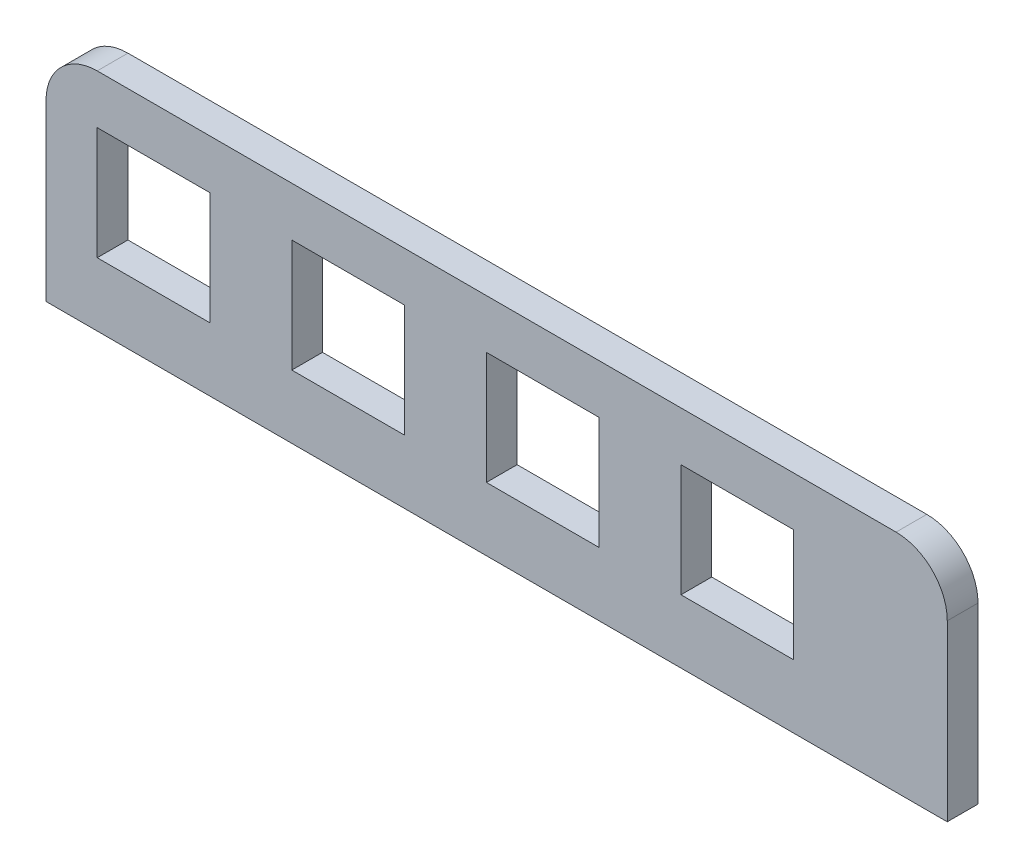
ISO-10303-21;
HEADER;
FILE_DESCRIPTION(('STEP AP214'),'2;1');
FILE_NAME('part.step','',(''),(''),'','','');
FILE_SCHEMA(('AUTOMOTIVE_DESIGN { 1 0 10303 214 1 1 1 1 }'));
ENDSEC;
DATA;
#1=APPLICATION_CONTEXT('core data for automotive mechanical design processes');
#2=APPLICATION_PROTOCOL_DEFINITION('international standard','automotive_design',2000,#1);
#3=PRODUCT_CONTEXT('',#1,'mechanical');
#4=PRODUCT('Part','Part','',(#3));
#5=PRODUCT_RELATED_PRODUCT_CATEGORY('part','',(#4));
#6=PRODUCT_DEFINITION_FORMATION('','',#4);
#7=PRODUCT_DEFINITION_CONTEXT('part definition',#1,'design');
#8=PRODUCT_DEFINITION('design','',#6,#7);
#9=PRODUCT_DEFINITION_SHAPE('','',#8);
#10=(LENGTH_UNIT() NAMED_UNIT(*) SI_UNIT(.MILLI.,.METRE.));
#11=(NAMED_UNIT(*) PLANE_ANGLE_UNIT() SI_UNIT($,.RADIAN.));
#12=(NAMED_UNIT(*) SI_UNIT($,.STERADIAN.) SOLID_ANGLE_UNIT());
#13=UNCERTAINTY_MEASURE_WITH_UNIT(LENGTH_MEASURE(1.E-05),#10,'distance_accuracy_value','');
#14=(GEOMETRIC_REPRESENTATION_CONTEXT(3) GLOBAL_UNCERTAINTY_ASSIGNED_CONTEXT((#13)) GLOBAL_UNIT_ASSIGNED_CONTEXT((#10,
#11,#12)) REPRESENTATION_CONTEXT('',''));
#15=CARTESIAN_POINT('',(0.,0.,0.));
#16=DIRECTION('',(0.,0.,1.));
#17=DIRECTION('',(1.,0.,0.));
#18=AXIS2_PLACEMENT_3D('',#15,#16,#17);
#19=CARTESIAN_POINT('',(5.,17.,3.));
#20=DIRECTION('',(0.,0.,-1.));
#21=DIRECTION('',(-1.,0.,0.));
#22=AXIS2_PLACEMENT_3D('',#19,#20,#21);
#23=PLANE('',#22);
#24=DIRECTION('',(0.,-1.,0.));
#25=VECTOR('',#24,1.);
#26=CARTESIAN_POINT('',(43.,6.2,3.));
#27=LINE('',#26,#25);
#28=CARTESIAN_POINT('',(43.,17.2,3.));
#29=VERTEX_POINT('',#28);
#30=CARTESIAN_POINT('',(43.,6.2,3.));
#31=VERTEX_POINT('',#30);
#32=EDGE_CURVE('E404',#29,#31,#27,.T.);
#33=ORIENTED_EDGE('',*,*,#32,.F.);
#34=DIRECTION('',(-1.,0.,0.));
#35=VECTOR('',#34,1.);
#36=CARTESIAN_POINT('',(43.,17.2,3.));
#37=LINE('',#36,#35);
#38=CARTESIAN_POINT('',(54.,17.2,3.));
#39=VERTEX_POINT('',#38);
#40=EDGE_CURVE('E400',#39,#29,#37,.T.);
#41=ORIENTED_EDGE('',*,*,#40,.F.);
#42=DIRECTION('',(0.,1.,0.));
#43=VECTOR('',#42,1.);
#44=CARTESIAN_POINT('',(54.,6.2,3.));
#45=LINE('',#44,#43);
#46=CARTESIAN_POINT('',(54.,6.2,3.));
#47=VERTEX_POINT('',#46);
#48=EDGE_CURVE('E415',#47,#39,#45,.T.);
#49=ORIENTED_EDGE('',*,*,#48,.F.);
#50=DIRECTION('',(1.,0.,0.));
#51=VECTOR('',#50,1.);
#52=CARTESIAN_POINT('',(43.,6.2,3.));
#53=LINE('',#52,#51);
#54=EDGE_CURVE('E422',#31,#47,#53,.T.);
#55=ORIENTED_EDGE('',*,*,#54,.F.);
#56=EDGE_LOOP('',(#33,#41,#49,#55));
#57=FACE_BOUND('',#56,.T.);
#58=DIRECTION('',(0.,-1.,0.));
#59=VECTOR('',#58,1.);
#60=CARTESIAN_POINT('',(5.,6.2,3.));
#61=LINE('',#60,#59);
#62=CARTESIAN_POINT('',(5.,17.2,3.));
#63=VERTEX_POINT('',#62);
#64=CARTESIAN_POINT('',(5.,6.2,3.));
#65=VERTEX_POINT('',#64);
#66=EDGE_CURVE('E342',#63,#65,#61,.T.);
#67=ORIENTED_EDGE('',*,*,#66,.F.);
#68=DIRECTION('',(-1.,0.,0.));
#69=VECTOR('',#68,1.);
#70=CARTESIAN_POINT('',(5.,17.2,3.));
#71=LINE('',#70,#69);
#72=CARTESIAN_POINT('',(16.,17.2,3.));
#73=VERTEX_POINT('',#72);
#74=EDGE_CURVE('E338',#73,#63,#71,.T.);
#75=ORIENTED_EDGE('',*,*,#74,.F.);
#76=DIRECTION('',(0.,1.,0.));
#77=VECTOR('',#76,1.);
#78=CARTESIAN_POINT('',(16.,6.2,3.));
#79=LINE('',#78,#77);
#80=CARTESIAN_POINT('',(16.,6.2,3.));
#81=VERTEX_POINT('',#80);
#82=EDGE_CURVE('E356',#81,#73,#79,.T.);
#83=ORIENTED_EDGE('',*,*,#82,.F.);
#84=DIRECTION('',(1.,0.,0.));
#85=VECTOR('',#84,1.);
#86=CARTESIAN_POINT('',(5.,6.2,3.));
#87=LINE('',#86,#85);
#88=EDGE_CURVE('E364',#65,#81,#87,.T.);
#89=ORIENTED_EDGE('',*,*,#88,.F.);
#90=EDGE_LOOP('',(#67,#75,#83,#89));
#91=FACE_BOUND('',#90,.T.);
#92=DIRECTION('',(0.,-1.,0.));
#93=VECTOR('',#92,1.);
#94=CARTESIAN_POINT('',(0.,0.,3.));
#95=LINE('',#94,#93);
#96=CARTESIAN_POINT('',(0.,17.,3.));
#97=VERTEX_POINT('',#96);
#98=CARTESIAN_POINT('',(0.,0.,3.));
#99=VERTEX_POINT('',#98);
#100=EDGE_CURVE('E272',#97,#99,#95,.T.);
#101=ORIENTED_EDGE('',*,*,#100,.T.);
#102=DIRECTION('',(1.,0.,0.));
#103=VECTOR('',#102,1.);
#104=CARTESIAN_POINT('',(0.,0.,3.));
#105=LINE('',#104,#103);
#106=CARTESIAN_POINT('',(88.,0.,3.));
#107=VERTEX_POINT('',#106);
#108=EDGE_CURVE('E313',#99,#107,#105,.T.);
#109=ORIENTED_EDGE('',*,*,#108,.T.);
#110=DIRECTION('',(0.,1.,0.));
#111=VECTOR('',#110,1.);
#112=CARTESIAN_POINT('',(88.,0.,3.));
#113=LINE('',#112,#111);
#114=CARTESIAN_POINT('',(88.,17.,3.));
#115=VERTEX_POINT('',#114);
#116=EDGE_CURVE('E290',#107,#115,#113,.T.);
#117=ORIENTED_EDGE('',*,*,#116,.T.);
#118=CARTESIAN_POINT('',(83.,17.,3.));
#119=DIRECTION('',(0.,0.,1.));
#120=DIRECTION('',(-1.,0.,0.));
#121=AXIS2_PLACEMENT_3D('',#118,#119,#120);
#122=CIRCLE('',#121,5.);
#123=CARTESIAN_POINT('',(83.,22.,3.));
#124=VERTEX_POINT('',#123);
#125=EDGE_CURVE('E310',#115,#124,#122,.T.);
#126=ORIENTED_EDGE('',*,*,#125,.T.);
#127=DIRECTION('',(-1.,0.,0.));
#128=VECTOR('',#127,1.);
#129=CARTESIAN_POINT('',(5.,22.,3.));
#130=LINE('',#129,#128);
#131=CARTESIAN_POINT('',(5.,22.,3.));
#132=VERTEX_POINT('',#131);
#133=EDGE_CURVE('E255',#124,#132,#130,.T.);
#134=ORIENTED_EDGE('',*,*,#133,.T.);
#135=CARTESIAN_POINT('',(5.,17.,3.));
#136=DIRECTION('',(0.,0.,1.));
#137=DIRECTION('',(-1.,0.,0.));
#138=AXIS2_PLACEMENT_3D('',#135,#136,#137);
#139=CIRCLE('',#138,5.);
#140=EDGE_CURVE('E250',#132,#97,#139,.T.);
#141=ORIENTED_EDGE('',*,*,#140,.T.);
#142=EDGE_LOOP('',(#101,#109,#117,#126,#134,#141));
#143=FACE_BOUND('',#142,.T.);
#144=DIRECTION('',(0.,-1.,0.));
#145=VECTOR('',#144,1.);
#146=CARTESIAN_POINT('',(24.,6.2,3.));
#147=LINE('',#146,#145);
#148=CARTESIAN_POINT('',(24.,17.2,3.));
#149=VERTEX_POINT('',#148);
#150=CARTESIAN_POINT('',(24.,6.2,3.));
#151=VERTEX_POINT('',#150);
#152=EDGE_CURVE('E230',#149,#151,#147,.T.);
#153=ORIENTED_EDGE('',*,*,#152,.F.);
#154=DIRECTION('',(-1.,0.,0.));
#155=VECTOR('',#154,1.);
#156=CARTESIAN_POINT('',(24.,17.2,3.));
#157=LINE('',#156,#155);
#158=CARTESIAN_POINT('',(35.,17.2,3.));
#159=VERTEX_POINT('',#158);
#160=EDGE_CURVE('E237',#159,#149,#157,.T.);
#161=ORIENTED_EDGE('',*,*,#160,.F.);
#162=DIRECTION('',(0.,1.,0.));
#163=VECTOR('',#162,1.);
#164=CARTESIAN_POINT('',(35.,6.2,3.));
#165=LINE('',#164,#163);
#166=CARTESIAN_POINT('',(35.,6.2,3.));
#167=VERTEX_POINT('',#166);
#168=EDGE_CURVE('E229',#167,#159,#165,.T.);
#169=ORIENTED_EDGE('',*,*,#168,.F.);
#170=DIRECTION('',(1.,0.,0.));
#171=VECTOR('',#170,1.);
#172=CARTESIAN_POINT('',(24.,6.2,3.));
#173=LINE('',#172,#171);
#174=EDGE_CURVE('E225',#151,#167,#173,.T.);
#175=ORIENTED_EDGE('',*,*,#174,.F.);
#176=EDGE_LOOP('',(#153,#161,#169,#175));
#177=FACE_BOUND('',#176,.T.);
#178=DIRECTION('',(0.,-1.,0.));
#179=VECTOR('',#178,1.);
#180=CARTESIAN_POINT('',(62.,6.2,3.));
#181=LINE('',#180,#179);
#182=CARTESIAN_POINT('',(62.,17.2,3.));
#183=VERTEX_POINT('',#182);
#184=CARTESIAN_POINT('',(62.,6.2,3.));
#185=VERTEX_POINT('',#184);
#186=EDGE_CURVE('E186',#183,#185,#181,.T.);
#187=ORIENTED_EDGE('',*,*,#186,.F.);
#188=DIRECTION('',(-1.,0.,0.));
#189=VECTOR('',#188,1.);
#190=CARTESIAN_POINT('',(62.,17.2,3.));
#191=LINE('',#190,#189);
#192=CARTESIAN_POINT('',(73.,17.2,3.));
#193=VERTEX_POINT('',#192);
#194=EDGE_CURVE('E210',#193,#183,#191,.T.);
#195=ORIENTED_EDGE('',*,*,#194,.F.);
#196=DIRECTION('',(0.,1.,0.));
#197=VECTOR('',#196,1.);
#198=CARTESIAN_POINT('',(73.,6.2,3.));
#199=LINE('',#198,#197);
#200=CARTESIAN_POINT('',(73.,6.2,3.));
#201=VERTEX_POINT('',#200);
#202=EDGE_CURVE('E207',#201,#193,#199,.T.);
#203=ORIENTED_EDGE('',*,*,#202,.F.);
#204=DIRECTION('',(1.,0.,0.));
#205=VECTOR('',#204,1.);
#206=CARTESIAN_POINT('',(62.,6.2,3.));
#207=LINE('',#206,#205);
#208=EDGE_CURVE('E195',#185,#201,#207,.T.);
#209=ORIENTED_EDGE('',*,*,#208,.F.);
#210=EDGE_LOOP('',(#187,#195,#203,#209));
#211=FACE_BOUND('',#210,.T.);
#212=ADVANCED_FACE('F37',(#57,#91,#143,#177,#211),#23,.F.);
#213=CARTESIAN_POINT('',(5.,17.,0.));
#214=DIRECTION('',(0.,0.,-1.));
#215=DIRECTION('',(-1.,0.,0.));
#216=AXIS2_PLACEMENT_3D('',#213,#214,#215);
#217=PLANE('',#216);
#218=DIRECTION('',(0.,-1.,0.));
#219=VECTOR('',#218,1.);
#220=CARTESIAN_POINT('',(0.,0.,0.));
#221=LINE('',#220,#219);
#222=CARTESIAN_POINT('',(0.,17.,0.));
#223=VERTEX_POINT('',#222);
#224=CARTESIAN_POINT('',(0.,0.,0.));
#225=VERTEX_POINT('',#224);
#226=EDGE_CURVE('E258',#223,#225,#221,.T.);
#227=ORIENTED_EDGE('',*,*,#226,.F.);
#228=CARTESIAN_POINT('',(5.,17.,0.));
#229=DIRECTION('',(0.,0.,1.));
#230=DIRECTION('',(-1.,0.,0.));
#231=AXIS2_PLACEMENT_3D('',#228,#229,#230);
#232=CIRCLE('',#231,5.);
#233=CARTESIAN_POINT('',(5.,22.,0.));
#234=VERTEX_POINT('',#233);
#235=EDGE_CURVE('E270',#234,#223,#232,.T.);
#236=ORIENTED_EDGE('',*,*,#235,.F.);
#237=DIRECTION('',(-1.,0.,0.));
#238=VECTOR('',#237,1.);
#239=CARTESIAN_POINT('',(5.,22.,0.));
#240=LINE('',#239,#238);
#241=CARTESIAN_POINT('',(83.,22.,0.));
#242=VERTEX_POINT('',#241);
#243=EDGE_CURVE('E268',#242,#234,#240,.T.);
#244=ORIENTED_EDGE('',*,*,#243,.F.);
#245=CARTESIAN_POINT('',(83.,17.,0.));
#246=DIRECTION('',(0.,0.,1.));
#247=DIRECTION('',(-1.,0.,0.));
#248=AXIS2_PLACEMENT_3D('',#245,#246,#247);
#249=CIRCLE('',#248,5.);
#250=CARTESIAN_POINT('',(88.,17.,0.));
#251=VERTEX_POINT('',#250);
#252=EDGE_CURVE('E266',#251,#242,#249,.T.);
#253=ORIENTED_EDGE('',*,*,#252,.F.);
#254=DIRECTION('',(0.,1.,0.));
#255=VECTOR('',#254,1.);
#256=CARTESIAN_POINT('',(88.,0.,0.));
#257=LINE('',#256,#255);
#258=CARTESIAN_POINT('',(88.,0.,0.));
#259=VERTEX_POINT('',#258);
#260=EDGE_CURVE('E264',#259,#251,#257,.T.);
#261=ORIENTED_EDGE('',*,*,#260,.F.);
#262=DIRECTION('',(1.,0.,0.));
#263=VECTOR('',#262,1.);
#264=CARTESIAN_POINT('',(0.,0.,0.));
#265=LINE('',#264,#263);
#266=EDGE_CURVE('E261',#225,#259,#265,.T.);
#267=ORIENTED_EDGE('',*,*,#266,.F.);
#268=EDGE_LOOP('',(#227,#236,#244,#253,#261,#267));
#269=FACE_BOUND('',#268,.T.);
#270=DIRECTION('',(-1.,0.,0.));
#271=VECTOR('',#270,1.);
#272=CARTESIAN_POINT('',(5.,17.2,0.));
#273=LINE('',#272,#271);
#274=CARTESIAN_POINT('',(16.,17.2,0.));
#275=VERTEX_POINT('',#274);
#276=CARTESIAN_POINT('',(5.,17.2,0.));
#277=VERTEX_POINT('',#276);
#278=EDGE_CURVE('E339',#275,#277,#273,.T.);
#279=ORIENTED_EDGE('',*,*,#278,.T.);
#280=DIRECTION('',(0.,-1.,0.));
#281=VECTOR('',#280,1.);
#282=CARTESIAN_POINT('',(5.,6.2,0.));
#283=LINE('',#282,#281);
#284=CARTESIAN_POINT('',(5.,6.2,0.));
#285=VERTEX_POINT('',#284);
#286=EDGE_CURVE('E349',#277,#285,#283,.T.);
#287=ORIENTED_EDGE('',*,*,#286,.T.);
#288=DIRECTION('',(1.,0.,0.));
#289=VECTOR('',#288,1.);
#290=CARTESIAN_POINT('',(5.,6.2,0.));
#291=LINE('',#290,#289);
#292=CARTESIAN_POINT('',(16.,6.2,0.));
#293=VERTEX_POINT('',#292);
#294=EDGE_CURVE('E346',#285,#293,#291,.T.);
#295=ORIENTED_EDGE('',*,*,#294,.T.);
#296=DIRECTION('',(0.,1.,0.));
#297=VECTOR('',#296,1.);
#298=CARTESIAN_POINT('',(16.,6.2,0.));
#299=LINE('',#298,#297);
#300=EDGE_CURVE('E343',#293,#275,#299,.T.);
#301=ORIENTED_EDGE('',*,*,#300,.T.);
#302=EDGE_LOOP('',(#279,#287,#295,#301));
#303=FACE_BOUND('',#302,.T.);
#304=DIRECTION('',(-1.,0.,0.));
#305=VECTOR('',#304,1.);
#306=CARTESIAN_POINT('',(24.,17.2,0.));
#307=LINE('',#306,#305);
#308=CARTESIAN_POINT('',(35.,17.2,0.));
#309=VERTEX_POINT('',#308);
#310=CARTESIAN_POINT('',(24.,17.2,0.));
#311=VERTEX_POINT('',#310);
#312=EDGE_CURVE('E378',#309,#311,#307,.T.);
#313=ORIENTED_EDGE('',*,*,#312,.T.);
#314=DIRECTION('',(0.,-1.,0.));
#315=VECTOR('',#314,1.);
#316=CARTESIAN_POINT('',(24.,6.2,0.));
#317=LINE('',#316,#315);
#318=CARTESIAN_POINT('',(24.,6.2,0.));
#319=VERTEX_POINT('',#318);
#320=EDGE_CURVE('E242',#311,#319,#317,.T.);
#321=ORIENTED_EDGE('',*,*,#320,.T.);
#322=DIRECTION('',(1.,0.,0.));
#323=VECTOR('',#322,1.);
#324=CARTESIAN_POINT('',(24.,6.2,0.));
#325=LINE('',#324,#323);
#326=CARTESIAN_POINT('',(35.,6.2,0.));
#327=VERTEX_POINT('',#326);
#328=EDGE_CURVE('E383',#319,#327,#325,.T.);
#329=ORIENTED_EDGE('',*,*,#328,.T.);
#330=DIRECTION('',(0.,1.,0.));
#331=VECTOR('',#330,1.);
#332=CARTESIAN_POINT('',(35.,6.2,0.));
#333=LINE('',#332,#331);
#334=EDGE_CURVE('E381',#327,#309,#333,.T.);
#335=ORIENTED_EDGE('',*,*,#334,.T.);
#336=EDGE_LOOP('',(#313,#321,#329,#335));
#337=FACE_BOUND('',#336,.T.);
#338=DIRECTION('',(-1.,0.,0.));
#339=VECTOR('',#338,1.);
#340=CARTESIAN_POINT('',(43.,17.2,0.));
#341=LINE('',#340,#339);
#342=CARTESIAN_POINT('',(54.,17.2,0.));
#343=VERTEX_POINT('',#342);
#344=CARTESIAN_POINT('',(43.,17.2,0.));
#345=VERTEX_POINT('',#344);
#346=EDGE_CURVE('E401',#343,#345,#341,.T.);
#347=ORIENTED_EDGE('',*,*,#346,.T.);
#348=DIRECTION('',(0.,-1.,0.));
#349=VECTOR('',#348,1.);
#350=CARTESIAN_POINT('',(43.,6.2,0.));
#351=LINE('',#350,#349);
#352=CARTESIAN_POINT('',(43.,6.2,0.));
#353=VERTEX_POINT('',#352);
#354=EDGE_CURVE('E203',#345,#353,#351,.T.);
#355=ORIENTED_EDGE('',*,*,#354,.T.);
#356=DIRECTION('',(1.,0.,0.));
#357=VECTOR('',#356,1.);
#358=CARTESIAN_POINT('',(43.,6.2,0.));
#359=LINE('',#358,#357);
#360=CARTESIAN_POINT('',(54.,6.2,0.));
#361=VERTEX_POINT('',#360);
#362=EDGE_CURVE('E408',#353,#361,#359,.T.);
#363=ORIENTED_EDGE('',*,*,#362,.T.);
#364=DIRECTION('',(0.,1.,0.));
#365=VECTOR('',#364,1.);
#366=CARTESIAN_POINT('',(54.,6.2,0.));
#367=LINE('',#366,#365);
#368=EDGE_CURVE('E405',#361,#343,#367,.T.);
#369=ORIENTED_EDGE('',*,*,#368,.T.);
#370=EDGE_LOOP('',(#347,#355,#363,#369));
#371=FACE_BOUND('',#370,.T.);
#372=DIRECTION('',(-1.,0.,0.));
#373=VECTOR('',#372,1.);
#374=CARTESIAN_POINT('',(62.,17.2,0.));
#375=LINE('',#374,#373);
#376=CARTESIAN_POINT('',(73.,17.2,0.));
#377=VERTEX_POINT('',#376);
#378=CARTESIAN_POINT('',(62.,17.2,0.));
#379=VERTEX_POINT('',#378);
#380=EDGE_CURVE('E196',#377,#379,#375,.T.);
#381=ORIENTED_EDGE('',*,*,#380,.T.);
#382=DIRECTION('',(0.,-1.,0.));
#383=VECTOR('',#382,1.);
#384=CARTESIAN_POINT('',(62.,6.2,0.));
#385=LINE('',#384,#383);
#386=CARTESIAN_POINT('',(62.,6.2,0.));
#387=VERTEX_POINT('',#386);
#388=EDGE_CURVE('E60',#379,#387,#385,.T.);
#389=ORIENTED_EDGE('',*,*,#388,.T.);
#390=DIRECTION('',(1.,0.,0.));
#391=VECTOR('',#390,1.);
#392=CARTESIAN_POINT('',(62.,6.2,0.));
#393=LINE('',#392,#391);
#394=CARTESIAN_POINT('',(73.,6.2,0.));
#395=VERTEX_POINT('',#394);
#396=EDGE_CURVE('E202',#387,#395,#393,.T.);
#397=ORIENTED_EDGE('',*,*,#396,.T.);
#398=DIRECTION('',(0.,1.,0.));
#399=VECTOR('',#398,1.);
#400=CARTESIAN_POINT('',(73.,6.2,0.));
#401=LINE('',#400,#399);
#402=EDGE_CURVE('E433',#395,#377,#401,.T.);
#403=ORIENTED_EDGE('',*,*,#402,.T.);
#404=EDGE_LOOP('',(#381,#389,#397,#403));
#405=FACE_BOUND('',#404,.T.);
#406=ADVANCED_FACE('F295',(#269,#303,#337,#371,#405),#217,.T.);
#407=CARTESIAN_POINT('',(0.,0.,3.));
#408=DIRECTION('',(1.,0.,0.));
#409=DIRECTION('',(0.,0.,-1.));
#410=AXIS2_PLACEMENT_3D('',#407,#408,#409);
#411=PLANE('',#410);
#412=ORIENTED_EDGE('',*,*,#226,.T.);
#413=DIRECTION('',(0.,0.,-1.));
#414=VECTOR('',#413,1.);
#415=CARTESIAN_POINT('',(0.,0.,3.));
#416=LINE('',#415,#414);
#417=EDGE_CURVE('E12',#99,#225,#416,.T.);
#418=ORIENTED_EDGE('',*,*,#417,.F.);
#419=ORIENTED_EDGE('',*,*,#100,.F.);
#420=DIRECTION('',(0.,0.,-1.));
#421=VECTOR('',#420,1.);
#422=CARTESIAN_POINT('',(0.,17.,3.));
#423=LINE('',#422,#421);
#424=EDGE_CURVE('E254',#97,#223,#423,.T.);
#425=ORIENTED_EDGE('',*,*,#424,.T.);
#426=EDGE_LOOP('',(#412,#418,#419,#425));
#427=FACE_BOUND('',#426,.T.);
#428=ADVANCED_FACE('F39',(#427),#411,.F.);
#429=CARTESIAN_POINT('',(0.,0.,3.));
#430=DIRECTION('',(0.,1.,0.));
#431=DIRECTION('',(0.,0.,1.));
#432=AXIS2_PLACEMENT_3D('',#429,#430,#431);
#433=PLANE('',#432);
#434=ORIENTED_EDGE('',*,*,#266,.T.);
#435=DIRECTION('',(0.,0.,-1.));
#436=VECTOR('',#435,1.);
#437=CARTESIAN_POINT('',(88.,0.,3.));
#438=LINE('',#437,#436);
#439=EDGE_CURVE('E45',#107,#259,#438,.T.);
#440=ORIENTED_EDGE('',*,*,#439,.F.);
#441=ORIENTED_EDGE('',*,*,#108,.F.);
#442=ORIENTED_EDGE('',*,*,#417,.T.);
#443=EDGE_LOOP('',(#434,#440,#441,#442));
#444=FACE_BOUND('',#443,.T.);
#445=ADVANCED_FACE('F492',(#444),#433,.F.);
#446=CARTESIAN_POINT('',(88.,0.,3.));
#447=DIRECTION('',(-1.,0.,0.));
#448=DIRECTION('',(0.,0.,1.));
#449=AXIS2_PLACEMENT_3D('',#446,#447,#448);
#450=PLANE('',#449);
#451=ORIENTED_EDGE('',*,*,#260,.T.);
#452=DIRECTION('',(0.,0.,-1.));
#453=VECTOR('',#452,1.);
#454=CARTESIAN_POINT('',(88.,17.,3.));
#455=LINE('',#454,#453);
#456=EDGE_CURVE('E281',#115,#251,#455,.T.);
#457=ORIENTED_EDGE('',*,*,#456,.F.);
#458=ORIENTED_EDGE('',*,*,#116,.F.);
#459=ORIENTED_EDGE('',*,*,#439,.T.);
#460=EDGE_LOOP('',(#451,#457,#458,#459));
#461=FACE_BOUND('',#460,.T.);
#462=ADVANCED_FACE('F288',(#461),#450,.F.);
#463=CARTESIAN_POINT('',(83.,17.,3.));
#464=DIRECTION('',(0.,0.,-1.));
#465=DIRECTION('',(-1.,0.,0.));
#466=AXIS2_PLACEMENT_3D('',#463,#464,#465);
#467=CYLINDRICAL_SURFACE('',#466,5.);
#468=ORIENTED_EDGE('',*,*,#252,.T.);
#469=DIRECTION('',(0.,0.,-1.));
#470=VECTOR('',#469,1.);
#471=CARTESIAN_POINT('',(83.,22.,3.));
#472=LINE('',#471,#470);
#473=EDGE_CURVE('E278',#124,#242,#472,.T.);
#474=ORIENTED_EDGE('',*,*,#473,.F.);
#475=ORIENTED_EDGE('',*,*,#125,.F.);
#476=ORIENTED_EDGE('',*,*,#456,.T.);
#477=EDGE_LOOP('',(#468,#474,#475,#476));
#478=FACE_BOUND('',#477,.T.);
#479=ADVANCED_FACE('F301',(#478),#467,.T.);
#480=CARTESIAN_POINT('',(5.,22.,3.));
#481=DIRECTION('',(0.,-1.,0.));
#482=DIRECTION('',(0.,0.,-1.));
#483=AXIS2_PLACEMENT_3D('',#480,#481,#482);
#484=PLANE('',#483);
#485=ORIENTED_EDGE('',*,*,#243,.T.);
#486=DIRECTION('',(0.,0.,-1.));
#487=VECTOR('',#486,1.);
#488=CARTESIAN_POINT('',(5.,22.,3.));
#489=LINE('',#488,#487);
#490=EDGE_CURVE('E275',#132,#234,#489,.T.);
#491=ORIENTED_EDGE('',*,*,#490,.F.);
#492=ORIENTED_EDGE('',*,*,#133,.F.);
#493=ORIENTED_EDGE('',*,*,#473,.T.);
#494=EDGE_LOOP('',(#485,#491,#492,#493));
#495=FACE_BOUND('',#494,.T.);
#496=ADVANCED_FACE('F305',(#495),#484,.F.);
#497=CARTESIAN_POINT('',(5.,17.,3.));
#498=DIRECTION('',(0.,0.,-1.));
#499=DIRECTION('',(-1.,0.,0.));
#500=AXIS2_PLACEMENT_3D('',#497,#498,#499);
#501=CYLINDRICAL_SURFACE('',#500,5.);
#502=ORIENTED_EDGE('',*,*,#235,.T.);
#503=ORIENTED_EDGE('',*,*,#424,.F.);
#504=ORIENTED_EDGE('',*,*,#140,.F.);
#505=ORIENTED_EDGE('',*,*,#490,.T.);
#506=EDGE_LOOP('',(#502,#503,#504,#505));
#507=FACE_BOUND('',#506,.T.);
#508=ADVANCED_FACE('F483',(#507),#501,.T.);
#509=CARTESIAN_POINT('',(5.,6.2,3.));
#510=DIRECTION('',(1.,0.,0.));
#511=DIRECTION('',(0.,0.,-1.));
#512=AXIS2_PLACEMENT_3D('',#509,#510,#511);
#513=PLANE('',#512);
#514=ORIENTED_EDGE('',*,*,#286,.F.);
#515=DIRECTION('',(0.,0.,-1.));
#516=VECTOR('',#515,1.);
#517=CARTESIAN_POINT('',(5.,17.2,3.));
#518=LINE('',#517,#516);
#519=EDGE_CURVE('E335',#63,#277,#518,.T.);
#520=ORIENTED_EDGE('',*,*,#519,.F.);
#521=ORIENTED_EDGE('',*,*,#66,.T.);
#522=DIRECTION('',(0.,0.,-1.));
#523=VECTOR('',#522,1.);
#524=CARTESIAN_POINT('',(5.,6.2,3.));
#525=LINE('',#524,#523);
#526=EDGE_CURVE('E262',#65,#285,#525,.T.);
#527=ORIENTED_EDGE('',*,*,#526,.T.);
#528=EDGE_LOOP('',(#514,#520,#521,#527));
#529=FACE_BOUND('',#528,.T.);
#530=ADVANCED_FACE('F480',(#529),#513,.T.);
#531=CARTESIAN_POINT('',(5.,6.2,3.));
#532=DIRECTION('',(0.,1.,0.));
#533=DIRECTION('',(0.,0.,1.));
#534=AXIS2_PLACEMENT_3D('',#531,#532,#533);
#535=PLANE('',#534);
#536=ORIENTED_EDGE('',*,*,#294,.F.);
#537=ORIENTED_EDGE('',*,*,#526,.F.);
#538=ORIENTED_EDGE('',*,*,#88,.T.);
#539=DIRECTION('',(0.,0.,-1.));
#540=VECTOR('',#539,1.);
#541=CARTESIAN_POINT('',(16.,6.2,3.));
#542=LINE('',#541,#540);
#543=EDGE_CURVE('E331',#81,#293,#542,.T.);
#544=ORIENTED_EDGE('',*,*,#543,.T.);
#545=EDGE_LOOP('',(#536,#537,#538,#544));
#546=FACE_BOUND('',#545,.T.);
#547=ADVANCED_FACE('F547',(#546),#535,.T.);
#548=CARTESIAN_POINT('',(16.,6.2,3.));
#549=DIRECTION('',(-1.,0.,0.));
#550=DIRECTION('',(0.,0.,1.));
#551=AXIS2_PLACEMENT_3D('',#548,#549,#550);
#552=PLANE('',#551);
#553=ORIENTED_EDGE('',*,*,#300,.F.);
#554=ORIENTED_EDGE('',*,*,#543,.F.);
#555=ORIENTED_EDGE('',*,*,#82,.T.);
#556=DIRECTION('',(0.,0.,-1.));
#557=VECTOR('',#556,1.);
#558=CARTESIAN_POINT('',(16.,17.2,3.));
#559=LINE('',#558,#557);
#560=EDGE_CURVE('E333',#73,#275,#559,.T.);
#561=ORIENTED_EDGE('',*,*,#560,.T.);
#562=EDGE_LOOP('',(#553,#554,#555,#561));
#563=FACE_BOUND('',#562,.T.);
#564=ADVANCED_FACE('F555',(#563),#552,.T.);
#565=CARTESIAN_POINT('',(5.,17.2,3.));
#566=DIRECTION('',(0.,-1.,0.));
#567=DIRECTION('',(0.,0.,-1.));
#568=AXIS2_PLACEMENT_3D('',#565,#566,#567);
#569=PLANE('',#568);
#570=ORIENTED_EDGE('',*,*,#278,.F.);
#571=ORIENTED_EDGE('',*,*,#560,.F.);
#572=ORIENTED_EDGE('',*,*,#74,.T.);
#573=ORIENTED_EDGE('',*,*,#519,.T.);
#574=EDGE_LOOP('',(#570,#571,#572,#573));
#575=FACE_BOUND('',#574,.T.);
#576=ADVANCED_FACE('F563',(#575),#569,.T.);
#577=CARTESIAN_POINT('',(24.,6.2,3.));
#578=DIRECTION('',(1.,0.,0.));
#579=DIRECTION('',(0.,0.,-1.));
#580=AXIS2_PLACEMENT_3D('',#577,#578,#579);
#581=PLANE('',#580);
#582=ORIENTED_EDGE('',*,*,#320,.F.);
#583=DIRECTION('',(0.,0.,-1.));
#584=VECTOR('',#583,1.);
#585=CARTESIAN_POINT('',(24.,17.2,3.));
#586=LINE('',#585,#584);
#587=EDGE_CURVE('E241',#149,#311,#586,.T.);
#588=ORIENTED_EDGE('',*,*,#587,.F.);
#589=ORIENTED_EDGE('',*,*,#152,.T.);
#590=DIRECTION('',(0.,0.,-1.));
#591=VECTOR('',#590,1.);
#592=CARTESIAN_POINT('',(24.,6.2,3.));
#593=LINE('',#592,#591);
#594=EDGE_CURVE('E352',#151,#319,#593,.T.);
#595=ORIENTED_EDGE('',*,*,#594,.T.);
#596=EDGE_LOOP('',(#582,#588,#589,#595));
#597=FACE_BOUND('',#596,.T.);
#598=ADVANCED_FACE('F445',(#597),#581,.T.);
#599=CARTESIAN_POINT('',(24.,6.2,3.));
#600=DIRECTION('',(0.,1.,0.));
#601=DIRECTION('',(-1.,0.,0.));
#602=AXIS2_PLACEMENT_3D('',#599,#600,#601);
#603=PLANE('',#602);
#604=ORIENTED_EDGE('',*,*,#328,.F.);
#605=ORIENTED_EDGE('',*,*,#594,.F.);
#606=ORIENTED_EDGE('',*,*,#174,.T.);
#607=DIRECTION('',(0.,0.,-1.));
#608=VECTOR('',#607,1.);
#609=CARTESIAN_POINT('',(35.,6.2,3.));
#610=LINE('',#609,#608);
#611=EDGE_CURVE('E372',#167,#327,#610,.T.);
#612=ORIENTED_EDGE('',*,*,#611,.T.);
#613=EDGE_LOOP('',(#604,#605,#606,#612));
#614=FACE_BOUND('',#613,.T.);
#615=ADVANCED_FACE('F450',(#614),#603,.T.);
#616=CARTESIAN_POINT('',(35.,6.2,3.));
#617=DIRECTION('',(-1.,0.,0.));
#618=DIRECTION('',(0.,0.,1.));
#619=AXIS2_PLACEMENT_3D('',#616,#617,#618);
#620=PLANE('',#619);
#621=ORIENTED_EDGE('',*,*,#334,.F.);
#622=ORIENTED_EDGE('',*,*,#611,.F.);
#623=ORIENTED_EDGE('',*,*,#168,.T.);
#624=DIRECTION('',(0.,0.,-1.));
#625=VECTOR('',#624,1.);
#626=CARTESIAN_POINT('',(35.,17.2,3.));
#627=LINE('',#626,#625);
#628=EDGE_CURVE('E374',#159,#309,#627,.T.);
#629=ORIENTED_EDGE('',*,*,#628,.T.);
#630=EDGE_LOOP('',(#621,#622,#623,#629));
#631=FACE_BOUND('',#630,.T.);
#632=ADVANCED_FACE('F455',(#631),#620,.T.);
#633=CARTESIAN_POINT('',(24.,17.2,3.));
#634=DIRECTION('',(0.,-1.,0.));
#635=DIRECTION('',(0.,0.,-1.));
#636=AXIS2_PLACEMENT_3D('',#633,#634,#635);
#637=PLANE('',#636);
#638=ORIENTED_EDGE('',*,*,#312,.F.);
#639=ORIENTED_EDGE('',*,*,#628,.F.);
#640=ORIENTED_EDGE('',*,*,#160,.T.);
#641=ORIENTED_EDGE('',*,*,#587,.T.);
#642=EDGE_LOOP('',(#638,#639,#640,#641));
#643=FACE_BOUND('',#642,.T.);
#644=ADVANCED_FACE('F459',(#643),#637,.T.);
#645=CARTESIAN_POINT('',(43.,6.2,3.));
#646=DIRECTION('',(1.,0.,0.));
#647=DIRECTION('',(0.,0.,-1.));
#648=AXIS2_PLACEMENT_3D('',#645,#646,#647);
#649=PLANE('',#648);
#650=ORIENTED_EDGE('',*,*,#354,.F.);
#651=DIRECTION('',(0.,0.,-1.));
#652=VECTOR('',#651,1.);
#653=CARTESIAN_POINT('',(43.,17.2,3.));
#654=LINE('',#653,#652);
#655=EDGE_CURVE('E397',#29,#345,#654,.T.);
#656=ORIENTED_EDGE('',*,*,#655,.F.);
#657=ORIENTED_EDGE('',*,*,#32,.T.);
#658=DIRECTION('',(0.,0.,-1.));
#659=VECTOR('',#658,1.);
#660=CARTESIAN_POINT('',(43.,6.2,3.));
#661=LINE('',#660,#659);
#662=EDGE_CURVE('E387',#31,#353,#661,.T.);
#663=ORIENTED_EDGE('',*,*,#662,.T.);
#664=EDGE_LOOP('',(#650,#656,#657,#663));
#665=FACE_BOUND('',#664,.T.);
#666=ADVANCED_FACE('F461',(#665),#649,.T.);
#667=CARTESIAN_POINT('',(43.,6.2,3.));
#668=DIRECTION('',(0.,1.,0.));
#669=DIRECTION('',(-1.,0.,0.));
#670=AXIS2_PLACEMENT_3D('',#667,#668,#669);
#671=PLANE('',#670);
#672=ORIENTED_EDGE('',*,*,#362,.F.);
#673=ORIENTED_EDGE('',*,*,#662,.F.);
#674=ORIENTED_EDGE('',*,*,#54,.T.);
#675=DIRECTION('',(0.,0.,-1.));
#676=VECTOR('',#675,1.);
#677=CARTESIAN_POINT('',(54.,6.2,3.));
#678=LINE('',#677,#676);
#679=EDGE_CURVE('E389',#47,#361,#678,.T.);
#680=ORIENTED_EDGE('',*,*,#679,.T.);
#681=EDGE_LOOP('',(#672,#673,#674,#680));
#682=FACE_BOUND('',#681,.T.);
#683=ADVANCED_FACE('F467',(#682),#671,.T.);
#684=CARTESIAN_POINT('',(54.,6.2,3.));
#685=DIRECTION('',(-1.,0.,0.));
#686=DIRECTION('',(0.,-1.,0.));
#687=AXIS2_PLACEMENT_3D('',#684,#685,#686);
#688=PLANE('',#687);
#689=ORIENTED_EDGE('',*,*,#368,.F.);
#690=ORIENTED_EDGE('',*,*,#679,.F.);
#691=ORIENTED_EDGE('',*,*,#48,.T.);
#692=DIRECTION('',(0.,0.,-1.));
#693=VECTOR('',#692,1.);
#694=CARTESIAN_POINT('',(54.,17.2,3.));
#695=LINE('',#694,#693);
#696=EDGE_CURVE('E393',#39,#343,#695,.T.);
#697=ORIENTED_EDGE('',*,*,#696,.T.);
#698=EDGE_LOOP('',(#689,#690,#691,#697));
#699=FACE_BOUND('',#698,.T.);
#700=ADVANCED_FACE('F608',(#699),#688,.T.);
#701=CARTESIAN_POINT('',(43.,17.2,3.));
#702=DIRECTION('',(0.,-1.,0.));
#703=DIRECTION('',(1.,0.,0.));
#704=AXIS2_PLACEMENT_3D('',#701,#702,#703);
#705=PLANE('',#704);
#706=ORIENTED_EDGE('',*,*,#346,.F.);
#707=ORIENTED_EDGE('',*,*,#696,.F.);
#708=ORIENTED_EDGE('',*,*,#40,.T.);
#709=ORIENTED_EDGE('',*,*,#655,.T.);
#710=EDGE_LOOP('',(#706,#707,#708,#709));
#711=FACE_BOUND('',#710,.T.);
#712=ADVANCED_FACE('F617',(#711),#705,.T.);
#713=CARTESIAN_POINT('',(62.,6.2,3.));
#714=DIRECTION('',(1.,0.,0.));
#715=DIRECTION('',(0.,0.,-1.));
#716=AXIS2_PLACEMENT_3D('',#713,#714,#715);
#717=PLANE('',#716);
#718=ORIENTED_EDGE('',*,*,#388,.F.);
#719=DIRECTION('',(0.,0.,-1.));
#720=VECTOR('',#719,1.);
#721=CARTESIAN_POINT('',(62.,17.2,3.));
#722=LINE('',#721,#720);
#723=EDGE_CURVE('E190',#183,#379,#722,.T.);
#724=ORIENTED_EDGE('',*,*,#723,.F.);
#725=ORIENTED_EDGE('',*,*,#186,.T.);
#726=DIRECTION('',(0.,0.,-1.));
#727=VECTOR('',#726,1.);
#728=CARTESIAN_POINT('',(62.,6.2,3.));
#729=LINE('',#728,#727);
#730=EDGE_CURVE('E189',#185,#387,#729,.T.);
#731=ORIENTED_EDGE('',*,*,#730,.T.);
#732=EDGE_LOOP('',(#718,#724,#725,#731));
#733=FACE_BOUND('',#732,.T.);
#734=ADVANCED_FACE('F188',(#733),#717,.T.);
#735=CARTESIAN_POINT('',(62.,6.2,3.));
#736=DIRECTION('',(0.,1.,0.));
#737=DIRECTION('',(-1.,0.,0.));
#738=AXIS2_PLACEMENT_3D('',#735,#736,#737);
#739=PLANE('',#738);
#740=ORIENTED_EDGE('',*,*,#396,.F.);
#741=ORIENTED_EDGE('',*,*,#730,.F.);
#742=ORIENTED_EDGE('',*,*,#208,.T.);
#743=DIRECTION('',(0.,0.,-1.));
#744=VECTOR('',#743,1.);
#745=CARTESIAN_POINT('',(73.,6.2,3.));
#746=LINE('',#745,#744);
#747=EDGE_CURVE('E204',#201,#395,#746,.T.);
#748=ORIENTED_EDGE('',*,*,#747,.T.);
#749=EDGE_LOOP('',(#740,#741,#742,#748));
#750=FACE_BOUND('',#749,.T.);
#751=ADVANCED_FACE('F199',(#750),#739,.T.);
#752=CARTESIAN_POINT('',(73.,6.2,3.));
#753=DIRECTION('',(-1.,0.,0.));
#754=DIRECTION('',(0.,0.,1.));
#755=AXIS2_PLACEMENT_3D('',#752,#753,#754);
#756=PLANE('',#755);
#757=ORIENTED_EDGE('',*,*,#402,.F.);
#758=ORIENTED_EDGE('',*,*,#747,.F.);
#759=ORIENTED_EDGE('',*,*,#202,.T.);
#760=DIRECTION('',(0.,0.,-1.));
#761=VECTOR('',#760,1.);
#762=CARTESIAN_POINT('',(73.,17.2,3.));
#763=LINE('',#762,#761);
#764=EDGE_CURVE('E52',#193,#377,#763,.T.);
#765=ORIENTED_EDGE('',*,*,#764,.T.);
#766=EDGE_LOOP('',(#757,#758,#759,#765));
#767=FACE_BOUND('',#766,.T.);
#768=ADVANCED_FACE('F641',(#767),#756,.T.);
#769=CARTESIAN_POINT('',(62.,17.2,3.));
#770=DIRECTION('',(0.,-1.,0.));
#771=DIRECTION('',(0.,0.,-1.));
#772=AXIS2_PLACEMENT_3D('',#769,#770,#771);
#773=PLANE('',#772);
#774=ORIENTED_EDGE('',*,*,#380,.F.);
#775=ORIENTED_EDGE('',*,*,#764,.F.);
#776=ORIENTED_EDGE('',*,*,#194,.T.);
#777=ORIENTED_EDGE('',*,*,#723,.T.);
#778=EDGE_LOOP('',(#774,#775,#776,#777));
#779=FACE_BOUND('',#778,.T.);
#780=ADVANCED_FACE('F438',(#779),#773,.T.);
#781=CLOSED_SHELL('',(#212,#406,#428,#445,#462,#479,#496,#508,#530,#547,#564,#576,#598,#615,
#632,#644,#666,#683,#700,#712,#734,#751,#768,#780));
#782=MANIFOLD_SOLID_BREP('B2',#781);
#783=ADVANCED_BREP_SHAPE_REPRESENTATION('',(#18,#782),#14);
#784=SHAPE_DEFINITION_REPRESENTATION(#9,#783);
ENDSEC;
END-ISO-10303-21;
